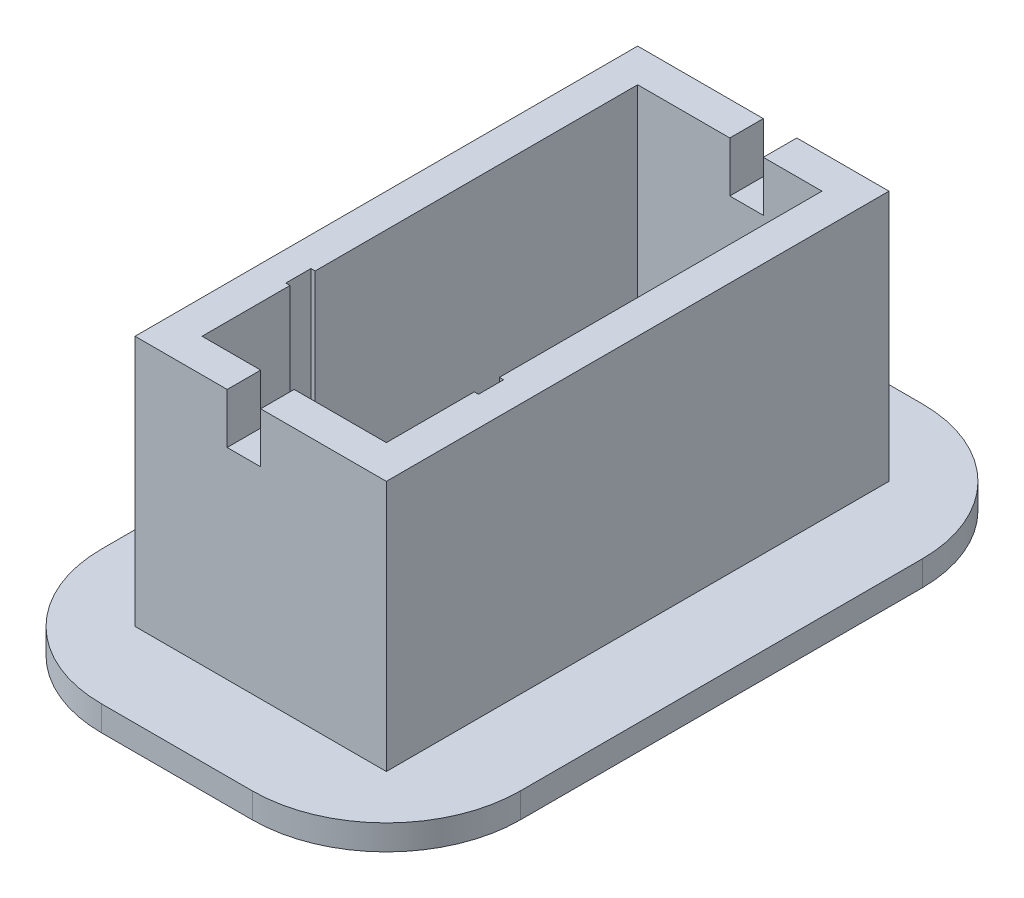
ISO-10303-21;
HEADER;
FILE_DESCRIPTION(('STEP AP214'),'2;1');
FILE_NAME('part.step','',(''),(''),'','','');
FILE_SCHEMA(('AUTOMOTIVE_DESIGN { 1 0 10303 214 1 1 1 1 }'));
ENDSEC;
DATA;
#1=APPLICATION_CONTEXT('core data for automotive mechanical design processes');
#2=APPLICATION_PROTOCOL_DEFINITION('international standard','automotive_design',2000,#1);
#3=PRODUCT_CONTEXT('',#1,'mechanical');
#4=PRODUCT('Part','Part','',(#3));
#5=PRODUCT_RELATED_PRODUCT_CATEGORY('part','',(#4));
#6=PRODUCT_DEFINITION_FORMATION('','',#4);
#7=PRODUCT_DEFINITION_CONTEXT('part definition',#1,'design');
#8=PRODUCT_DEFINITION('design','',#6,#7);
#9=PRODUCT_DEFINITION_SHAPE('','',#8);
#10=(LENGTH_UNIT() NAMED_UNIT(*) SI_UNIT(.MILLI.,.METRE.));
#11=(NAMED_UNIT(*) PLANE_ANGLE_UNIT() SI_UNIT($,.RADIAN.));
#12=(NAMED_UNIT(*) SI_UNIT($,.STERADIAN.) SOLID_ANGLE_UNIT());
#13=UNCERTAINTY_MEASURE_WITH_UNIT(LENGTH_MEASURE(1.E-05),#10,'distance_accuracy_value','');
#14=(GEOMETRIC_REPRESENTATION_CONTEXT(3) GLOBAL_UNCERTAINTY_ASSIGNED_CONTEXT((#13)) GLOBAL_UNIT_ASSIGNED_CONTEXT((#10,
#11,#12)) REPRESENTATION_CONTEXT('',''));
#15=CARTESIAN_POINT('',(0.,0.,0.));
#16=DIRECTION('',(0.,0.,1.));
#17=DIRECTION('',(1.,0.,0.));
#18=AXIS2_PLACEMENT_3D('',#15,#16,#17);
#19=CARTESIAN_POINT('',(0.,15.,0.));
#20=DIRECTION('',(0.,-1.,0.));
#21=DIRECTION('',(0.,0.,-1.));
#22=AXIS2_PLACEMENT_3D('',#19,#20,#21);
#23=PLANE('',#22);
#24=DIRECTION('',(1.,0.,0.));
#25=VECTOR('',#24,1.);
#26=CARTESIAN_POINT('',(2.,15.,-2.));
#27=LINE('',#26,#25);
#28=CARTESIAN_POINT('',(7.5,15.,-2.));
#29=VERTEX_POINT('',#28);
#30=CARTESIAN_POINT('',(13.,15.,-2.));
#31=VERTEX_POINT('',#30);
#32=EDGE_CURVE('E326',#29,#31,#27,.T.);
#33=ORIENTED_EDGE('',*,*,#32,.F.);
#34=DIRECTION('',(0.,0.,-1.));
#35=VECTOR('',#34,1.);
#36=CARTESIAN_POINT('',(7.5,15.,-2.));
#37=LINE('',#36,#35);
#38=CARTESIAN_POINT('',(7.5,15.,0.));
#39=VERTEX_POINT('',#38);
#40=EDGE_CURVE('E880',#39,#29,#37,.T.);
#41=ORIENTED_EDGE('',*,*,#40,.F.);
#42=DIRECTION('',(1.,0.,0.));
#43=VECTOR('',#42,1.);
#44=CARTESIAN_POINT('',(0.,15.,0.));
#45=LINE('',#44,#43);
#46=CARTESIAN_POINT('',(15.,15.,0.));
#47=VERTEX_POINT('',#46);
#48=EDGE_CURVE('E415',#39,#47,#45,.T.);
#49=ORIENTED_EDGE('',*,*,#48,.T.);
#50=DIRECTION('',(0.,0.,-1.));
#51=VECTOR('',#50,1.);
#52=CARTESIAN_POINT('',(15.,15.,0.));
#53=LINE('',#52,#51);
#54=CARTESIAN_POINT('',(15.,15.,-30.));
#55=VERTEX_POINT('',#54);
#56=EDGE_CURVE('E420',#47,#55,#53,.T.);
#57=ORIENTED_EDGE('',*,*,#56,.T.);
#58=DIRECTION('',(-1.,0.,0.));
#59=VECTOR('',#58,1.);
#60=CARTESIAN_POINT('',(0.,15.,-30.));
#61=LINE('',#60,#59);
#62=CARTESIAN_POINT('',(9.5,15.,-30.));
#63=VERTEX_POINT('',#62);
#64=EDGE_CURVE('E423',#55,#63,#61,.T.);
#65=ORIENTED_EDGE('',*,*,#64,.T.);
#66=DIRECTION('',(0.,0.,-1.));
#67=VECTOR('',#66,1.);
#68=CARTESIAN_POINT('',(9.5,15.,-30.));
#69=LINE('',#68,#67);
#70=CARTESIAN_POINT('',(9.5,15.,-28.));
#71=VERTEX_POINT('',#70);
#72=EDGE_CURVE('E280',#71,#63,#69,.T.);
#73=ORIENTED_EDGE('',*,*,#72,.F.);
#74=DIRECTION('',(-1.,0.,0.));
#75=VECTOR('',#74,1.);
#76=CARTESIAN_POINT('',(2.,15.,-28.));
#77=LINE('',#76,#75);
#78=CARTESIAN_POINT('',(13.,15.,-28.));
#79=VERTEX_POINT('',#78);
#80=EDGE_CURVE('E340',#79,#71,#77,.T.);
#81=ORIENTED_EDGE('',*,*,#80,.F.);
#82=DIRECTION('',(0.,0.,-1.));
#83=VECTOR('',#82,1.);
#84=CARTESIAN_POINT('',(13.,15.,-8.75));
#85=LINE('',#84,#83);
#86=CARTESIAN_POINT('',(13.,15.,-8.75));
#87=VERTEX_POINT('',#86);
#88=EDGE_CURVE('E337',#87,#79,#85,.T.);
#89=ORIENTED_EDGE('',*,*,#88,.F.);
#90=DIRECTION('',(-1.,0.,0.));
#91=VECTOR('',#90,1.);
#92=CARTESIAN_POINT('',(13.,15.,-8.75));
#93=LINE('',#92,#91);
#94=CARTESIAN_POINT('',(13.25,15.,-8.75));
#95=VERTEX_POINT('',#94);
#96=EDGE_CURVE('E335',#95,#87,#93,.T.);
#97=ORIENTED_EDGE('',*,*,#96,.F.);
#98=DIRECTION('',(0.,0.,-1.));
#99=VECTOR('',#98,1.);
#100=CARTESIAN_POINT('',(13.25,15.,-8.75));
#101=LINE('',#100,#99);
#102=CARTESIAN_POINT('',(13.25,15.,-7.25));
#103=VERTEX_POINT('',#102);
#104=EDGE_CURVE('E333',#103,#95,#101,.T.);
#105=ORIENTED_EDGE('',*,*,#104,.F.);
#106=DIRECTION('',(1.,0.,0.));
#107=VECTOR('',#106,1.);
#108=CARTESIAN_POINT('',(13.,15.,-7.25));
#109=LINE('',#108,#107);
#110=CARTESIAN_POINT('',(13.,15.,-7.25));
#111=VERTEX_POINT('',#110);
#112=EDGE_CURVE('E331',#111,#103,#109,.T.);
#113=ORIENTED_EDGE('',*,*,#112,.F.);
#114=DIRECTION('',(0.,0.,-1.));
#115=VECTOR('',#114,1.);
#116=CARTESIAN_POINT('',(13.,15.,-2.));
#117=LINE('',#116,#115);
#118=EDGE_CURVE('E329',#31,#111,#117,.T.);
#119=ORIENTED_EDGE('',*,*,#118,.F.);
#120=EDGE_LOOP('',(#33,#41,#49,#57,#65,#73,#81,#89,#97,#105,#113,#119));
#121=FACE_BOUND('',#120,.T.);
#122=ADVANCED_FACE('F35',(#121),#23,.F.);
#123=CARTESIAN_POINT('',(0.,15.,0.));
#124=VERTEX_POINT('',#123);
#125=CARTESIAN_POINT('',(5.5,15.,0.));
#126=VERTEX_POINT('',#125);
#127=EDGE_CURVE('E417',#124,#126,#45,.T.);
#128=ORIENTED_EDGE('',*,*,#127,.T.);
#129=DIRECTION('',(0.,0.,1.));
#130=VECTOR('',#129,1.);
#131=CARTESIAN_POINT('',(5.5,15.,-2.));
#132=LINE('',#131,#130);
#133=CARTESIAN_POINT('',(5.5,15.,-2.));
#134=VERTEX_POINT('',#133);
#135=EDGE_CURVE('E882',#134,#126,#132,.T.);
#136=ORIENTED_EDGE('',*,*,#135,.F.);
#137=CARTESIAN_POINT('',(2.,15.,-2.));
#138=VERTEX_POINT('',#137);
#139=EDGE_CURVE('E269',#138,#134,#27,.T.);
#140=ORIENTED_EDGE('',*,*,#139,.F.);
#141=DIRECTION('',(0.,0.,1.));
#142=VECTOR('',#141,1.);
#143=CARTESIAN_POINT('',(2.,15.,-2.));
#144=LINE('',#143,#142);
#145=CARTESIAN_POINT('',(2.,15.,-7.25));
#146=VERTEX_POINT('',#145);
#147=EDGE_CURVE('E324',#146,#138,#144,.T.);
#148=ORIENTED_EDGE('',*,*,#147,.F.);
#149=DIRECTION('',(1.,0.,0.));
#150=VECTOR('',#149,1.);
#151=CARTESIAN_POINT('',(2.,15.,-7.25));
#152=LINE('',#151,#150);
#153=CARTESIAN_POINT('',(1.75,15.,-7.25));
#154=VERTEX_POINT('',#153);
#155=EDGE_CURVE('E350',#154,#146,#152,.T.);
#156=ORIENTED_EDGE('',*,*,#155,.F.);
#157=DIRECTION('',(0.,0.,1.));
#158=VECTOR('',#157,1.);
#159=CARTESIAN_POINT('',(1.75,15.,-8.75));
#160=LINE('',#159,#158);
#161=CARTESIAN_POINT('',(1.75,15.,-8.75));
#162=VERTEX_POINT('',#161);
#163=EDGE_CURVE('E347',#162,#154,#160,.T.);
#164=ORIENTED_EDGE('',*,*,#163,.F.);
#165=DIRECTION('',(-1.,0.,0.));
#166=VECTOR('',#165,1.);
#167=CARTESIAN_POINT('',(2.,15.,-8.75));
#168=LINE('',#167,#166);
#169=CARTESIAN_POINT('',(2.,15.,-8.75));
#170=VERTEX_POINT('',#169);
#171=EDGE_CURVE('E345',#170,#162,#168,.T.);
#172=ORIENTED_EDGE('',*,*,#171,.F.);
#173=DIRECTION('',(0.,0.,1.));
#174=VECTOR('',#173,1.);
#175=CARTESIAN_POINT('',(2.,15.,-8.75));
#176=LINE('',#175,#174);
#177=CARTESIAN_POINT('',(2.,15.,-28.));
#178=VERTEX_POINT('',#177);
#179=EDGE_CURVE('E343',#178,#170,#176,.T.);
#180=ORIENTED_EDGE('',*,*,#179,.F.);
#181=CARTESIAN_POINT('',(7.5,15.,-28.));
#182=VERTEX_POINT('',#181);
#183=EDGE_CURVE('E339',#182,#178,#77,.T.);
#184=ORIENTED_EDGE('',*,*,#183,.F.);
#185=DIRECTION('',(0.,0.,1.));
#186=VECTOR('',#185,1.);
#187=CARTESIAN_POINT('',(7.5,15.,-30.));
#188=LINE('',#187,#186);
#189=CARTESIAN_POINT('',(7.5,15.,-30.));
#190=VERTEX_POINT('',#189);
#191=EDGE_CURVE('E290',#190,#182,#188,.T.);
#192=ORIENTED_EDGE('',*,*,#191,.F.);
#193=CARTESIAN_POINT('',(0.,15.,-30.));
#194=VERTEX_POINT('',#193);
#195=EDGE_CURVE('E422',#190,#194,#61,.T.);
#196=ORIENTED_EDGE('',*,*,#195,.T.);
#197=DIRECTION('',(0.,0.,1.));
#198=VECTOR('',#197,1.);
#199=CARTESIAN_POINT('',(0.,15.,0.));
#200=LINE('',#199,#198);
#201=EDGE_CURVE('E412',#194,#124,#200,.T.);
#202=ORIENTED_EDGE('',*,*,#201,.T.);
#203=EDGE_LOOP('',(#128,#136,#140,#148,#156,#164,#172,#180,#184,#192,#196,#202));
#204=FACE_BOUND('',#203,.T.);
#205=ADVANCED_FACE('F517',(#204),#23,.F.);
#206=CARTESIAN_POINT('',(0.,15.,0.));
#207=DIRECTION('',(1.,0.,0.));
#208=DIRECTION('',(0.,0.,-1.));
#209=AXIS2_PLACEMENT_3D('',#206,#207,#208);
#210=PLANE('',#209);
#211=DIRECTION('',(0.,0.,1.));
#212=VECTOR('',#211,1.);
#213=CARTESIAN_POINT('',(0.,0.,0.));
#214=LINE('',#213,#212);
#215=CARTESIAN_POINT('',(0.,0.,-30.));
#216=VERTEX_POINT('',#215);
#217=CARTESIAN_POINT('',(0.,0.,0.));
#218=VERTEX_POINT('',#217);
#219=EDGE_CURVE('E411',#216,#218,#214,.T.);
#220=ORIENTED_EDGE('',*,*,#219,.T.);
#221=DIRECTION('',(0.,-1.,0.));
#222=VECTOR('',#221,1.);
#223=CARTESIAN_POINT('',(0.,15.,0.));
#224=LINE('',#223,#222);
#225=EDGE_CURVE('E445',#124,#218,#224,.T.);
#226=ORIENTED_EDGE('',*,*,#225,.F.);
#227=ORIENTED_EDGE('',*,*,#201,.F.);
#228=DIRECTION('',(0.,-1.,0.));
#229=VECTOR('',#228,1.);
#230=CARTESIAN_POINT('',(0.,15.,-30.));
#231=LINE('',#230,#229);
#232=EDGE_CURVE('E426',#194,#216,#231,.T.);
#233=ORIENTED_EDGE('',*,*,#232,.T.);
#234=EDGE_LOOP('',(#220,#226,#227,#233));
#235=FACE_BOUND('',#234,.T.);
#236=ADVANCED_FACE('F523',(#235),#210,.F.);
#237=CARTESIAN_POINT('',(0.,15.,0.));
#238=DIRECTION('',(0.,0.,-1.));
#239=DIRECTION('',(-1.,0.,0.));
#240=AXIS2_PLACEMENT_3D('',#237,#238,#239);
#241=PLANE('',#240);
#242=ORIENTED_EDGE('',*,*,#48,.F.);
#243=DIRECTION('',(0.,1.,0.));
#244=VECTOR('',#243,1.);
#245=CARTESIAN_POINT('',(7.5,12.,0.));
#246=LINE('',#245,#244);
#247=CARTESIAN_POINT('',(7.5,12.,0.));
#248=VERTEX_POINT('',#247);
#249=EDGE_CURVE('E272',#248,#39,#246,.T.);
#250=ORIENTED_EDGE('',*,*,#249,.F.);
#251=DIRECTION('',(1.,0.,0.));
#252=VECTOR('',#251,1.);
#253=CARTESIAN_POINT('',(7.5,12.,0.));
#254=LINE('',#253,#252);
#255=CARTESIAN_POINT('',(5.5,12.,0.));
#256=VERTEX_POINT('',#255);
#257=EDGE_CURVE('E255',#256,#248,#254,.T.);
#258=ORIENTED_EDGE('',*,*,#257,.F.);
#259=DIRECTION('',(0.,1.,0.));
#260=VECTOR('',#259,1.);
#261=CARTESIAN_POINT('',(5.5,12.,0.));
#262=LINE('',#261,#260);
#263=EDGE_CURVE('E251',#256,#126,#262,.T.);
#264=ORIENTED_EDGE('',*,*,#263,.T.);
#265=ORIENTED_EDGE('',*,*,#127,.F.);
#266=ORIENTED_EDGE('',*,*,#225,.T.);
#267=DIRECTION('',(1.,0.,0.));
#268=VECTOR('',#267,1.);
#269=CARTESIAN_POINT('',(0.,0.,0.));
#270=LINE('',#269,#268);
#271=CARTESIAN_POINT('',(15.,0.,0.));
#272=VERTEX_POINT('',#271);
#273=EDGE_CURVE('E429',#218,#272,#270,.T.);
#274=ORIENTED_EDGE('',*,*,#273,.T.);
#275=DIRECTION('',(0.,-1.,0.));
#276=VECTOR('',#275,1.);
#277=CARTESIAN_POINT('',(15.,15.,0.));
#278=LINE('',#277,#276);
#279=EDGE_CURVE('E442',#47,#272,#278,.T.);
#280=ORIENTED_EDGE('',*,*,#279,.F.);
#281=EDGE_LOOP('',(#242,#250,#258,#264,#265,#266,#274,#280));
#282=FACE_BOUND('',#281,.T.);
#283=ADVANCED_FACE('F537',(#282),#241,.F.);
#284=CARTESIAN_POINT('',(15.,15.,0.));
#285=DIRECTION('',(-1.,0.,0.));
#286=DIRECTION('',(0.,0.,1.));
#287=AXIS2_PLACEMENT_3D('',#284,#285,#286);
#288=PLANE('',#287);
#289=DIRECTION('',(0.,0.,-1.));
#290=VECTOR('',#289,1.);
#291=CARTESIAN_POINT('',(15.,0.,0.));
#292=LINE('',#291,#290);
#293=CARTESIAN_POINT('',(15.,0.,-30.));
#294=VERTEX_POINT('',#293);
#295=EDGE_CURVE('E432',#272,#294,#292,.T.);
#296=ORIENTED_EDGE('',*,*,#295,.T.);
#297=DIRECTION('',(0.,-1.,0.));
#298=VECTOR('',#297,1.);
#299=CARTESIAN_POINT('',(15.,15.,-30.));
#300=LINE('',#299,#298);
#301=EDGE_CURVE('E439',#55,#294,#300,.T.);
#302=ORIENTED_EDGE('',*,*,#301,.F.);
#303=ORIENTED_EDGE('',*,*,#56,.F.);
#304=ORIENTED_EDGE('',*,*,#279,.T.);
#305=EDGE_LOOP('',(#296,#302,#303,#304));
#306=FACE_BOUND('',#305,.T.);
#307=ADVANCED_FACE('F533',(#306),#288,.F.);
#308=CARTESIAN_POINT('',(0.,15.,-30.));
#309=DIRECTION('',(0.,0.,1.));
#310=DIRECTION('',(1.,0.,0.));
#311=AXIS2_PLACEMENT_3D('',#308,#309,#310);
#312=PLANE('',#311);
#313=ORIENTED_EDGE('',*,*,#195,.F.);
#314=DIRECTION('',(0.,1.,0.));
#315=VECTOR('',#314,1.);
#316=CARTESIAN_POINT('',(7.5,12.,-30.));
#317=LINE('',#316,#315);
#318=CARTESIAN_POINT('',(7.5,12.,-30.));
#319=VERTEX_POINT('',#318);
#320=EDGE_CURVE('E293',#319,#190,#317,.T.);
#321=ORIENTED_EDGE('',*,*,#320,.F.);
#322=DIRECTION('',(-1.,0.,0.));
#323=VECTOR('',#322,1.);
#324=CARTESIAN_POINT('',(7.5,12.,-30.));
#325=LINE('',#324,#323);
#326=CARTESIAN_POINT('',(9.5,12.,-30.));
#327=VERTEX_POINT('',#326);
#328=EDGE_CURVE('E286',#327,#319,#325,.T.);
#329=ORIENTED_EDGE('',*,*,#328,.F.);
#330=DIRECTION('',(0.,1.,0.));
#331=VECTOR('',#330,1.);
#332=CARTESIAN_POINT('',(9.5,12.,-30.));
#333=LINE('',#332,#331);
#334=EDGE_CURVE('E296',#327,#63,#333,.T.);
#335=ORIENTED_EDGE('',*,*,#334,.T.);
#336=ORIENTED_EDGE('',*,*,#64,.F.);
#337=ORIENTED_EDGE('',*,*,#301,.T.);
#338=DIRECTION('',(-1.,0.,0.));
#339=VECTOR('',#338,1.);
#340=CARTESIAN_POINT('',(0.,0.,-30.));
#341=LINE('',#340,#339);
#342=EDGE_CURVE('E416',#294,#216,#341,.T.);
#343=ORIENTED_EDGE('',*,*,#342,.T.);
#344=ORIENTED_EDGE('',*,*,#232,.F.);
#345=EDGE_LOOP('',(#313,#321,#329,#335,#336,#337,#343,#344));
#346=FACE_BOUND('',#345,.T.);
#347=ADVANCED_FACE('F530',(#346),#312,.F.);
#348=CARTESIAN_POINT('',(2.,15.,-2.));
#349=DIRECTION('',(1.,0.,0.));
#350=DIRECTION('',(0.,0.,-1.));
#351=AXIS2_PLACEMENT_3D('',#348,#349,#350);
#352=PLANE('',#351);
#353=DIRECTION('',(0.,0.,1.));
#354=VECTOR('',#353,1.);
#355=CARTESIAN_POINT('',(2.,0.,-2.));
#356=LINE('',#355,#354);
#357=CARTESIAN_POINT('',(2.,0.,-7.25));
#358=VERTEX_POINT('',#357);
#359=CARTESIAN_POINT('',(2.,0.,-2.));
#360=VERTEX_POINT('',#359);
#361=EDGE_CURVE('E314',#358,#360,#356,.T.);
#362=ORIENTED_EDGE('',*,*,#361,.F.);
#363=DIRECTION('',(0.,-1.,0.));
#364=VECTOR('',#363,1.);
#365=CARTESIAN_POINT('',(2.,15.,-7.25));
#366=LINE('',#365,#364);
#367=EDGE_CURVE('E352',#146,#358,#366,.T.);
#368=ORIENTED_EDGE('',*,*,#367,.F.);
#369=ORIENTED_EDGE('',*,*,#147,.T.);
#370=DIRECTION('',(0.,-1.,0.));
#371=VECTOR('',#370,1.);
#372=CARTESIAN_POINT('',(2.,15.,-2.));
#373=LINE('',#372,#371);
#374=EDGE_CURVE('E408',#138,#360,#373,.T.);
#375=ORIENTED_EDGE('',*,*,#374,.T.);
#376=EDGE_LOOP('',(#362,#368,#369,#375));
#377=FACE_BOUND('',#376,.T.);
#378=ADVANCED_FACE('F528',(#377),#352,.T.);
#379=CARTESIAN_POINT('',(2.,15.,-2.));
#380=DIRECTION('',(0.,0.,-1.));
#381=DIRECTION('',(-1.,0.,0.));
#382=AXIS2_PLACEMENT_3D('',#379,#380,#381);
#383=PLANE('',#382);
#384=DIRECTION('',(0.,1.,0.));
#385=VECTOR('',#384,1.);
#386=CARTESIAN_POINT('',(7.5,12.,-2.));
#387=LINE('',#386,#385);
#388=CARTESIAN_POINT('',(7.5,12.,-2.));
#389=VERTEX_POINT('',#388);
#390=EDGE_CURVE('E270',#389,#29,#387,.T.);
#391=ORIENTED_EDGE('',*,*,#390,.T.);
#392=ORIENTED_EDGE('',*,*,#32,.T.);
#393=DIRECTION('',(0.,-1.,0.));
#394=VECTOR('',#393,1.);
#395=CARTESIAN_POINT('',(13.,15.,-2.));
#396=LINE('',#395,#394);
#397=CARTESIAN_POINT('',(13.,0.,-2.));
#398=VERTEX_POINT('',#397);
#399=EDGE_CURVE('E406',#31,#398,#396,.T.);
#400=ORIENTED_EDGE('',*,*,#399,.T.);
#401=DIRECTION('',(1.,0.,0.));
#402=VECTOR('',#401,1.);
#403=CARTESIAN_POINT('',(2.,0.,-2.));
#404=LINE('',#403,#402);
#405=EDGE_CURVE('E355',#360,#398,#404,.T.);
#406=ORIENTED_EDGE('',*,*,#405,.F.);
#407=ORIENTED_EDGE('',*,*,#374,.F.);
#408=ORIENTED_EDGE('',*,*,#139,.T.);
#409=DIRECTION('',(0.,1.,0.));
#410=VECTOR('',#409,1.);
#411=CARTESIAN_POINT('',(5.5,12.,-2.));
#412=LINE('',#411,#410);
#413=CARTESIAN_POINT('',(5.5,12.,-2.));
#414=VERTEX_POINT('',#413);
#415=EDGE_CURVE('E248',#414,#134,#412,.T.);
#416=ORIENTED_EDGE('',*,*,#415,.F.);
#417=DIRECTION('',(-1.,0.,0.));
#418=VECTOR('',#417,1.);
#419=CARTESIAN_POINT('',(7.5,12.,-2.));
#420=LINE('',#419,#418);
#421=EDGE_CURVE('E256',#389,#414,#420,.T.);
#422=ORIENTED_EDGE('',*,*,#421,.F.);
#423=EDGE_LOOP('',(#391,#392,#400,#406,#407,#408,#416,#422));
#424=FACE_BOUND('',#423,.T.);
#425=ADVANCED_FACE('F266',(#424),#383,.T.);
#426=CARTESIAN_POINT('',(13.,15.,-2.));
#427=DIRECTION('',(-1.,0.,0.));
#428=DIRECTION('',(0.,0.,1.));
#429=AXIS2_PLACEMENT_3D('',#426,#427,#428);
#430=PLANE('',#429);
#431=DIRECTION('',(0.,0.,-1.));
#432=VECTOR('',#431,1.);
#433=CARTESIAN_POINT('',(13.,0.,-2.));
#434=LINE('',#433,#432);
#435=CARTESIAN_POINT('',(13.,0.,-7.25));
#436=VERTEX_POINT('',#435);
#437=EDGE_CURVE('E358',#398,#436,#434,.T.);
#438=ORIENTED_EDGE('',*,*,#437,.F.);
#439=ORIENTED_EDGE('',*,*,#399,.F.);
#440=ORIENTED_EDGE('',*,*,#118,.T.);
#441=DIRECTION('',(0.,-1.,0.));
#442=VECTOR('',#441,1.);
#443=CARTESIAN_POINT('',(13.,15.,-7.25));
#444=LINE('',#443,#442);
#445=EDGE_CURVE('E404',#111,#436,#444,.T.);
#446=ORIENTED_EDGE('',*,*,#445,.T.);
#447=EDGE_LOOP('',(#438,#439,#440,#446));
#448=FACE_BOUND('',#447,.T.);
#449=ADVANCED_FACE('F755',(#448),#430,.T.);
#450=CARTESIAN_POINT('',(13.,15.,-7.25));
#451=DIRECTION('',(0.,0.,-1.));
#452=DIRECTION('',(-1.,0.,0.));
#453=AXIS2_PLACEMENT_3D('',#450,#451,#452);
#454=PLANE('',#453);
#455=DIRECTION('',(1.,0.,0.));
#456=VECTOR('',#455,1.);
#457=CARTESIAN_POINT('',(13.,0.,-7.25));
#458=LINE('',#457,#456);
#459=CARTESIAN_POINT('',(13.25,0.,-7.25));
#460=VERTEX_POINT('',#459);
#461=EDGE_CURVE('E361',#436,#460,#458,.T.);
#462=ORIENTED_EDGE('',*,*,#461,.F.);
#463=ORIENTED_EDGE('',*,*,#445,.F.);
#464=ORIENTED_EDGE('',*,*,#112,.T.);
#465=DIRECTION('',(0.,-1.,0.));
#466=VECTOR('',#465,1.);
#467=CARTESIAN_POINT('',(13.25,15.,-7.25));
#468=LINE('',#467,#466);
#469=EDGE_CURVE('E402',#103,#460,#468,.T.);
#470=ORIENTED_EDGE('',*,*,#469,.T.);
#471=EDGE_LOOP('',(#462,#463,#464,#470));
#472=FACE_BOUND('',#471,.T.);
#473=ADVANCED_FACE('F746',(#472),#454,.T.);
#474=CARTESIAN_POINT('',(13.25,15.,-8.75));
#475=DIRECTION('',(-1.,0.,0.));
#476=DIRECTION('',(0.,0.,1.));
#477=AXIS2_PLACEMENT_3D('',#474,#475,#476);
#478=PLANE('',#477);
#479=DIRECTION('',(0.,0.,-1.));
#480=VECTOR('',#479,1.);
#481=CARTESIAN_POINT('',(13.25,0.,-8.75));
#482=LINE('',#481,#480);
#483=CARTESIAN_POINT('',(13.25,0.,-8.75));
#484=VERTEX_POINT('',#483);
#485=EDGE_CURVE('E364',#460,#484,#482,.T.);
#486=ORIENTED_EDGE('',*,*,#485,.F.);
#487=ORIENTED_EDGE('',*,*,#469,.F.);
#488=ORIENTED_EDGE('',*,*,#104,.T.);
#489=DIRECTION('',(0.,-1.,0.));
#490=VECTOR('',#489,1.);
#491=CARTESIAN_POINT('',(13.25,15.,-8.75));
#492=LINE('',#491,#490);
#493=EDGE_CURVE('E400',#95,#484,#492,.T.);
#494=ORIENTED_EDGE('',*,*,#493,.T.);
#495=EDGE_LOOP('',(#486,#487,#488,#494));
#496=FACE_BOUND('',#495,.T.);
#497=ADVANCED_FACE('F737',(#496),#478,.T.);
#498=CARTESIAN_POINT('',(13.,15.,-8.75));
#499=DIRECTION('',(0.,0.,1.));
#500=DIRECTION('',(1.,0.,0.));
#501=AXIS2_PLACEMENT_3D('',#498,#499,#500);
#502=PLANE('',#501);
#503=DIRECTION('',(-1.,0.,0.));
#504=VECTOR('',#503,1.);
#505=CARTESIAN_POINT('',(13.,0.,-8.75));
#506=LINE('',#505,#504);
#507=CARTESIAN_POINT('',(13.,0.,-8.75));
#508=VERTEX_POINT('',#507);
#509=EDGE_CURVE('E367',#484,#508,#506,.T.);
#510=ORIENTED_EDGE('',*,*,#509,.F.);
#511=ORIENTED_EDGE('',*,*,#493,.F.);
#512=ORIENTED_EDGE('',*,*,#96,.T.);
#513=DIRECTION('',(0.,-1.,0.));
#514=VECTOR('',#513,1.);
#515=CARTESIAN_POINT('',(13.,15.,-8.75));
#516=LINE('',#515,#514);
#517=EDGE_CURVE('E398',#87,#508,#516,.T.);
#518=ORIENTED_EDGE('',*,*,#517,.T.);
#519=EDGE_LOOP('',(#510,#511,#512,#518));
#520=FACE_BOUND('',#519,.T.);
#521=ADVANCED_FACE('F728',(#520),#502,.T.);
#522=CARTESIAN_POINT('',(13.,15.,-8.75));
#523=DIRECTION('',(-1.,0.,0.));
#524=DIRECTION('',(0.,0.,1.));
#525=AXIS2_PLACEMENT_3D('',#522,#523,#524);
#526=PLANE('',#525);
#527=DIRECTION('',(0.,0.,-1.));
#528=VECTOR('',#527,1.);
#529=CARTESIAN_POINT('',(13.,0.,-8.75));
#530=LINE('',#529,#528);
#531=CARTESIAN_POINT('',(13.,0.,-28.));
#532=VERTEX_POINT('',#531);
#533=EDGE_CURVE('E370',#508,#532,#530,.T.);
#534=ORIENTED_EDGE('',*,*,#533,.F.);
#535=ORIENTED_EDGE('',*,*,#517,.F.);
#536=ORIENTED_EDGE('',*,*,#88,.T.);
#537=DIRECTION('',(0.,-1.,0.));
#538=VECTOR('',#537,1.);
#539=CARTESIAN_POINT('',(13.,15.,-28.));
#540=LINE('',#539,#538);
#541=EDGE_CURVE('E396',#79,#532,#540,.T.);
#542=ORIENTED_EDGE('',*,*,#541,.T.);
#543=EDGE_LOOP('',(#534,#535,#536,#542));
#544=FACE_BOUND('',#543,.T.);
#545=ADVANCED_FACE('F719',(#544),#526,.T.);
#546=CARTESIAN_POINT('',(2.,15.,-28.));
#547=DIRECTION('',(0.,0.,1.));
#548=DIRECTION('',(1.,0.,0.));
#549=AXIS2_PLACEMENT_3D('',#546,#547,#548);
#550=PLANE('',#549);
#551=DIRECTION('',(0.,1.,0.));
#552=VECTOR('',#551,1.);
#553=CARTESIAN_POINT('',(7.5,12.,-28.));
#554=LINE('',#553,#552);
#555=CARTESIAN_POINT('',(7.5,12.,-28.));
#556=VERTEX_POINT('',#555);
#557=EDGE_CURVE('E289',#556,#182,#554,.T.);
#558=ORIENTED_EDGE('',*,*,#557,.T.);
#559=ORIENTED_EDGE('',*,*,#183,.T.);
#560=DIRECTION('',(0.,-1.,0.));
#561=VECTOR('',#560,1.);
#562=CARTESIAN_POINT('',(2.,15.,-28.));
#563=LINE('',#562,#561);
#564=CARTESIAN_POINT('',(2.,0.,-28.));
#565=VERTEX_POINT('',#564);
#566=EDGE_CURVE('E394',#178,#565,#563,.T.);
#567=ORIENTED_EDGE('',*,*,#566,.T.);
#568=DIRECTION('',(-1.,0.,0.));
#569=VECTOR('',#568,1.);
#570=CARTESIAN_POINT('',(2.,0.,-28.));
#571=LINE('',#570,#569);
#572=EDGE_CURVE('E373',#532,#565,#571,.T.);
#573=ORIENTED_EDGE('',*,*,#572,.F.);
#574=ORIENTED_EDGE('',*,*,#541,.F.);
#575=ORIENTED_EDGE('',*,*,#80,.T.);
#576=DIRECTION('',(0.,1.,0.));
#577=VECTOR('',#576,1.);
#578=CARTESIAN_POINT('',(9.5,12.,-28.));
#579=LINE('',#578,#577);
#580=CARTESIAN_POINT('',(9.5,12.,-28.));
#581=VERTEX_POINT('',#580);
#582=EDGE_CURVE('E299',#581,#71,#579,.T.);
#583=ORIENTED_EDGE('',*,*,#582,.F.);
#584=DIRECTION('',(1.,0.,0.));
#585=VECTOR('',#584,1.);
#586=CARTESIAN_POINT('',(7.5,12.,-28.));
#587=LINE('',#586,#585);
#588=EDGE_CURVE('E279',#556,#581,#587,.T.);
#589=ORIENTED_EDGE('',*,*,#588,.F.);
#590=EDGE_LOOP('',(#558,#559,#567,#573,#574,#575,#583,#589));
#591=FACE_BOUND('',#590,.T.);
#592=ADVANCED_FACE('F710',(#591),#550,.T.);
#593=CARTESIAN_POINT('',(2.,15.,-8.75));
#594=DIRECTION('',(1.,0.,0.));
#595=DIRECTION('',(0.,0.,-1.));
#596=AXIS2_PLACEMENT_3D('',#593,#594,#595);
#597=PLANE('',#596);
#598=DIRECTION('',(0.,0.,1.));
#599=VECTOR('',#598,1.);
#600=CARTESIAN_POINT('',(2.,0.,-8.75));
#601=LINE('',#600,#599);
#602=CARTESIAN_POINT('',(2.,0.,-8.75));
#603=VERTEX_POINT('',#602);
#604=EDGE_CURVE('E376',#565,#603,#601,.T.);
#605=ORIENTED_EDGE('',*,*,#604,.F.);
#606=ORIENTED_EDGE('',*,*,#566,.F.);
#607=ORIENTED_EDGE('',*,*,#179,.T.);
#608=DIRECTION('',(0.,-1.,0.));
#609=VECTOR('',#608,1.);
#610=CARTESIAN_POINT('',(2.,15.,-8.75));
#611=LINE('',#610,#609);
#612=EDGE_CURVE('E392',#170,#603,#611,.T.);
#613=ORIENTED_EDGE('',*,*,#612,.T.);
#614=EDGE_LOOP('',(#605,#606,#607,#613));
#615=FACE_BOUND('',#614,.T.);
#616=ADVANCED_FACE('F701',(#615),#597,.T.);
#617=CARTESIAN_POINT('',(2.,15.,-8.75));
#618=DIRECTION('',(0.,0.,1.));
#619=DIRECTION('',(1.,0.,0.));
#620=AXIS2_PLACEMENT_3D('',#617,#618,#619);
#621=PLANE('',#620);
#622=DIRECTION('',(-1.,0.,0.));
#623=VECTOR('',#622,1.);
#624=CARTESIAN_POINT('',(2.,0.,-8.75));
#625=LINE('',#624,#623);
#626=CARTESIAN_POINT('',(1.75,0.,-8.75));
#627=VERTEX_POINT('',#626);
#628=EDGE_CURVE('E379',#603,#627,#625,.T.);
#629=ORIENTED_EDGE('',*,*,#628,.F.);
#630=ORIENTED_EDGE('',*,*,#612,.F.);
#631=ORIENTED_EDGE('',*,*,#171,.T.);
#632=DIRECTION('',(0.,-1.,0.));
#633=VECTOR('',#632,1.);
#634=CARTESIAN_POINT('',(1.75,15.,-8.75));
#635=LINE('',#634,#633);
#636=EDGE_CURVE('E390',#162,#627,#635,.T.);
#637=ORIENTED_EDGE('',*,*,#636,.T.);
#638=EDGE_LOOP('',(#629,#630,#631,#637));
#639=FACE_BOUND('',#638,.T.);
#640=ADVANCED_FACE('F692',(#639),#621,.T.);
#641=CARTESIAN_POINT('',(1.75,15.,-8.75));
#642=DIRECTION('',(1.,0.,0.));
#643=DIRECTION('',(0.,0.,-1.));
#644=AXIS2_PLACEMENT_3D('',#641,#642,#643);
#645=PLANE('',#644);
#646=DIRECTION('',(0.,0.,1.));
#647=VECTOR('',#646,1.);
#648=CARTESIAN_POINT('',(1.75,0.,-8.75));
#649=LINE('',#648,#647);
#650=CARTESIAN_POINT('',(1.75,0.,-7.25));
#651=VERTEX_POINT('',#650);
#652=EDGE_CURVE('E382',#627,#651,#649,.T.);
#653=ORIENTED_EDGE('',*,*,#652,.F.);
#654=ORIENTED_EDGE('',*,*,#636,.F.);
#655=ORIENTED_EDGE('',*,*,#163,.T.);
#656=DIRECTION('',(0.,-1.,0.));
#657=VECTOR('',#656,1.);
#658=CARTESIAN_POINT('',(1.75,15.,-7.25));
#659=LINE('',#658,#657);
#660=EDGE_CURVE('E388',#154,#651,#659,.T.);
#661=ORIENTED_EDGE('',*,*,#660,.T.);
#662=EDGE_LOOP('',(#653,#654,#655,#661));
#663=FACE_BOUND('',#662,.T.);
#664=ADVANCED_FACE('F683',(#663),#645,.T.);
#665=CARTESIAN_POINT('',(2.,15.,-7.25));
#666=DIRECTION('',(0.,0.,-1.));
#667=DIRECTION('',(-1.,0.,0.));
#668=AXIS2_PLACEMENT_3D('',#665,#666,#667);
#669=PLANE('',#668);
#670=DIRECTION('',(1.,0.,0.));
#671=VECTOR('',#670,1.);
#672=CARTESIAN_POINT('',(2.,0.,-7.25));
#673=LINE('',#672,#671);
#674=EDGE_CURVE('E327',#651,#358,#673,.T.);
#675=ORIENTED_EDGE('',*,*,#674,.F.);
#676=ORIENTED_EDGE('',*,*,#660,.F.);
#677=ORIENTED_EDGE('',*,*,#155,.T.);
#678=ORIENTED_EDGE('',*,*,#367,.T.);
#679=EDGE_LOOP('',(#675,#676,#677,#678));
#680=FACE_BOUND('',#679,.T.);
#681=ADVANCED_FACE('F675',(#680),#669,.T.);
#682=CARTESIAN_POINT('',(0.,0.,0.));
#683=DIRECTION('',(0.,-1.,0.));
#684=DIRECTION('',(0.,0.,-1.));
#685=AXIS2_PLACEMENT_3D('',#682,#683,#684);
#686=PLANE('',#685);
#687=ORIENTED_EDGE('',*,*,#361,.T.);
#688=ORIENTED_EDGE('',*,*,#405,.T.);
#689=ORIENTED_EDGE('',*,*,#437,.T.);
#690=ORIENTED_EDGE('',*,*,#461,.T.);
#691=ORIENTED_EDGE('',*,*,#485,.T.);
#692=ORIENTED_EDGE('',*,*,#509,.T.);
#693=ORIENTED_EDGE('',*,*,#533,.T.);
#694=ORIENTED_EDGE('',*,*,#572,.T.);
#695=ORIENTED_EDGE('',*,*,#604,.T.);
#696=ORIENTED_EDGE('',*,*,#628,.T.);
#697=ORIENTED_EDGE('',*,*,#652,.T.);
#698=ORIENTED_EDGE('',*,*,#674,.T.);
#699=EDGE_LOOP('',(#687,#688,#689,#690,#691,#692,#693,#694,#695,#696,#697,#698));
#700=FACE_BOUND('',#699,.T.);
#701=ADVANCED_FACE('F668',(#700),#686,.F.);
#702=DIRECTION('',(0.,0.,1.));
#703=VECTOR('',#702,1.);
#704=CARTESIAN_POINT('',(20.,0.,5.));
#705=LINE('',#704,#703);
#706=CARTESIAN_POINT('',(20.,0.,-27.));
#707=VERTEX_POINT('',#706);
#708=CARTESIAN_POINT('',(20.,0.,-3.));
#709=VERTEX_POINT('',#708);
#710=EDGE_CURVE('E320',#707,#709,#705,.T.);
#711=ORIENTED_EDGE('',*,*,#710,.F.);
#712=CARTESIAN_POINT('',(12.,0.,-27.));
#713=DIRECTION('',(0.,-1.,0.));
#714=DIRECTION('',(0.,0.,-1.));
#715=AXIS2_PLACEMENT_3D('',#712,#713,#714);
#716=CIRCLE('',#715,8.);
#717=CARTESIAN_POINT('',(12.,0.,-35.));
#718=VERTEX_POINT('',#717);
#719=EDGE_CURVE('E459',#707,#718,#716,.F.);
#720=ORIENTED_EDGE('',*,*,#719,.T.);
#721=DIRECTION('',(1.,0.,0.));
#722=VECTOR('',#721,1.);
#723=CARTESIAN_POINT('',(-5.,0.,-35.));
#724=LINE('',#723,#722);
#725=CARTESIAN_POINT('',(3.,0.,-35.));
#726=VERTEX_POINT('',#725);
#727=EDGE_CURVE('E317',#726,#718,#724,.T.);
#728=ORIENTED_EDGE('',*,*,#727,.F.);
#729=CARTESIAN_POINT('',(3.,0.,-27.));
#730=DIRECTION('',(0.,-1.,0.));
#731=DIRECTION('',(0.,0.,-1.));
#732=AXIS2_PLACEMENT_3D('',#729,#730,#731);
#733=CIRCLE('',#732,8.);
#734=CARTESIAN_POINT('',(-5.,0.,-27.));
#735=VERTEX_POINT('',#734);
#736=EDGE_CURVE('E457',#726,#735,#733,.F.);
#737=ORIENTED_EDGE('',*,*,#736,.T.);
#738=DIRECTION('',(0.,0.,-1.));
#739=VECTOR('',#738,1.);
#740=CARTESIAN_POINT('',(-5.,0.,5.));
#741=LINE('',#740,#739);
#742=CARTESIAN_POINT('',(-5.,0.,-3.));
#743=VERTEX_POINT('',#742);
#744=EDGE_CURVE('E295',#743,#735,#741,.T.);
#745=ORIENTED_EDGE('',*,*,#744,.F.);
#746=CARTESIAN_POINT('',(3.,0.,-3.));
#747=DIRECTION('',(0.,-1.,0.));
#748=DIRECTION('',(0.,0.,-1.));
#749=AXIS2_PLACEMENT_3D('',#746,#747,#748);
#750=CIRCLE('',#749,8.);
#751=CARTESIAN_POINT('',(3.,0.,5.));
#752=VERTEX_POINT('',#751);
#753=EDGE_CURVE('E453',#743,#752,#750,.F.);
#754=ORIENTED_EDGE('',*,*,#753,.T.);
#755=DIRECTION('',(-1.,0.,0.));
#756=VECTOR('',#755,1.);
#757=CARTESIAN_POINT('',(-5.,0.,5.));
#758=LINE('',#757,#756);
#759=CARTESIAN_POINT('',(12.,0.,5.));
#760=VERTEX_POINT('',#759);
#761=EDGE_CURVE('E307',#760,#752,#758,.T.);
#762=ORIENTED_EDGE('',*,*,#761,.F.);
#763=CARTESIAN_POINT('',(12.,0.,-3.));
#764=DIRECTION('',(0.,-1.,0.));
#765=DIRECTION('',(0.,0.,-1.));
#766=AXIS2_PLACEMENT_3D('',#763,#764,#765);
#767=CIRCLE('',#766,8.);
#768=EDGE_CURVE('E455',#760,#709,#767,.F.);
#769=ORIENTED_EDGE('',*,*,#768,.T.);
#770=EDGE_LOOP('',(#711,#720,#728,#737,#745,#754,#762,#769));
#771=FACE_BOUND('',#770,.T.);
#772=ORIENTED_EDGE('',*,*,#273,.F.);
#773=ORIENTED_EDGE('',*,*,#219,.F.);
#774=ORIENTED_EDGE('',*,*,#342,.F.);
#775=ORIENTED_EDGE('',*,*,#295,.F.);
#776=EDGE_LOOP('',(#772,#773,#774,#775));
#777=FACE_BOUND('',#776,.T.);
#778=ADVANCED_FACE('F496',(#771,#777),#686,.F.);
#779=CARTESIAN_POINT('',(-5.,-1.5,5.));
#780=DIRECTION('',(1.,0.,0.));
#781=DIRECTION('',(0.,0.,-1.));
#782=AXIS2_PLACEMENT_3D('',#779,#780,#781);
#783=PLANE('',#782);
#784=ORIENTED_EDGE('',*,*,#744,.T.);
#785=DIRECTION('',(0.,1.,0.));
#786=VECTOR('',#785,1.);
#787=CARTESIAN_POINT('',(-5.,-1.5,-27.));
#788=LINE('',#787,#786);
#789=CARTESIAN_POINT('',(-5.,-1.5,-27.));
#790=VERTEX_POINT('',#789);
#791=EDGE_CURVE('E476',#735,#790,#788,.F.);
#792=ORIENTED_EDGE('',*,*,#791,.T.);
#793=DIRECTION('',(0.,0.,-1.));
#794=VECTOR('',#793,1.);
#795=CARTESIAN_POINT('',(-5.,-1.5,5.));
#796=LINE('',#795,#794);
#797=CARTESIAN_POINT('',(-5.,-1.5,-3.));
#798=VERTEX_POINT('',#797);
#799=EDGE_CURVE('E303',#798,#790,#796,.T.);
#800=ORIENTED_EDGE('',*,*,#799,.F.);
#801=DIRECTION('',(0.,1.,0.));
#802=VECTOR('',#801,1.);
#803=CARTESIAN_POINT('',(-5.,-1.5,-3.));
#804=LINE('',#803,#802);
#805=EDGE_CURVE('E473',#798,#743,#804,.T.);
#806=ORIENTED_EDGE('',*,*,#805,.T.);
#807=EDGE_LOOP('',(#784,#792,#800,#806));
#808=FACE_BOUND('',#807,.T.);
#809=ADVANCED_FACE('F480',(#808),#783,.F.);
#810=CARTESIAN_POINT('',(-5.,-1.5,-35.));
#811=DIRECTION('',(0.,0.,1.));
#812=DIRECTION('',(1.,0.,0.));
#813=AXIS2_PLACEMENT_3D('',#810,#811,#812);
#814=PLANE('',#813);
#815=ORIENTED_EDGE('',*,*,#727,.T.);
#816=DIRECTION('',(0.,1.,0.));
#817=VECTOR('',#816,1.);
#818=CARTESIAN_POINT('',(12.,-1.5,-35.));
#819=LINE('',#818,#817);
#820=CARTESIAN_POINT('',(12.,-1.5,-35.));
#821=VERTEX_POINT('',#820);
#822=EDGE_CURVE('E464',#718,#821,#819,.F.);
#823=ORIENTED_EDGE('',*,*,#822,.T.);
#824=DIRECTION('',(1.,0.,0.));
#825=VECTOR('',#824,1.);
#826=CARTESIAN_POINT('',(-5.,-1.5,-35.));
#827=LINE('',#826,#825);
#828=CARTESIAN_POINT('',(3.,-1.5,-35.));
#829=VERTEX_POINT('',#828);
#830=EDGE_CURVE('E306',#829,#821,#827,.T.);
#831=ORIENTED_EDGE('',*,*,#830,.F.);
#832=DIRECTION('',(0.,1.,0.));
#833=VECTOR('',#832,1.);
#834=CARTESIAN_POINT('',(3.,-1.5,-35.));
#835=LINE('',#834,#833);
#836=EDGE_CURVE('E461',#829,#726,#835,.T.);
#837=ORIENTED_EDGE('',*,*,#836,.T.);
#838=EDGE_LOOP('',(#815,#823,#831,#837));
#839=FACE_BOUND('',#838,.T.);
#840=ADVANCED_FACE('F492',(#839),#814,.F.);
#841=CARTESIAN_POINT('',(20.,-1.5,5.));
#842=DIRECTION('',(-1.,0.,0.));
#843=DIRECTION('',(0.,0.,1.));
#844=AXIS2_PLACEMENT_3D('',#841,#842,#843);
#845=PLANE('',#844);
#846=DIRECTION('',(0.,0.,1.));
#847=VECTOR('',#846,1.);
#848=CARTESIAN_POINT('',(20.,-1.5,5.));
#849=LINE('',#848,#847);
#850=CARTESIAN_POINT('',(20.,-1.5,-27.));
#851=VERTEX_POINT('',#850);
#852=CARTESIAN_POINT('',(20.,-1.5,-3.));
#853=VERTEX_POINT('',#852);
#854=EDGE_CURVE('E310',#851,#853,#849,.T.);
#855=ORIENTED_EDGE('',*,*,#854,.F.);
#856=DIRECTION('',(0.,1.,0.));
#857=VECTOR('',#856,1.);
#858=CARTESIAN_POINT('',(20.,-1.5,-27.));
#859=LINE('',#858,#857);
#860=EDGE_CURVE('E450',#851,#707,#859,.T.);
#861=ORIENTED_EDGE('',*,*,#860,.T.);
#862=ORIENTED_EDGE('',*,*,#710,.T.);
#863=DIRECTION('',(0.,1.,0.));
#864=VECTOR('',#863,1.);
#865=CARTESIAN_POINT('',(20.,-1.5,-3.));
#866=LINE('',#865,#864);
#867=EDGE_CURVE('E448',#709,#853,#866,.F.);
#868=ORIENTED_EDGE('',*,*,#867,.T.);
#869=EDGE_LOOP('',(#855,#861,#862,#868));
#870=FACE_BOUND('',#869,.T.);
#871=ADVANCED_FACE('F504',(#870),#845,.F.);
#872=CARTESIAN_POINT('',(-5.,-1.5,5.));
#873=DIRECTION('',(0.,0.,-1.));
#874=DIRECTION('',(-1.,0.,0.));
#875=AXIS2_PLACEMENT_3D('',#872,#873,#874);
#876=PLANE('',#875);
#877=DIRECTION('',(-1.,0.,0.));
#878=VECTOR('',#877,1.);
#879=CARTESIAN_POINT('',(-5.,-1.5,5.));
#880=LINE('',#879,#878);
#881=CARTESIAN_POINT('',(12.,-1.5,5.));
#882=VERTEX_POINT('',#881);
#883=CARTESIAN_POINT('',(3.,-1.5,5.));
#884=VERTEX_POINT('',#883);
#885=EDGE_CURVE('E312',#882,#884,#880,.T.);
#886=ORIENTED_EDGE('',*,*,#885,.F.);
#887=DIRECTION('',(0.,1.,0.));
#888=VECTOR('',#887,1.);
#889=CARTESIAN_POINT('',(12.,-1.5,5.));
#890=LINE('',#889,#888);
#891=EDGE_CURVE('E11',#882,#760,#890,.T.);
#892=ORIENTED_EDGE('',*,*,#891,.T.);
#893=ORIENTED_EDGE('',*,*,#761,.T.);
#894=DIRECTION('',(0.,1.,0.));
#895=VECTOR('',#894,1.);
#896=CARTESIAN_POINT('',(3.,-1.5,5.));
#897=LINE('',#896,#895);
#898=EDGE_CURVE('E43',#752,#884,#897,.F.);
#899=ORIENTED_EDGE('',*,*,#898,.T.);
#900=EDGE_LOOP('',(#886,#892,#893,#899));
#901=FACE_BOUND('',#900,.T.);
#902=ADVANCED_FACE('F510',(#901),#876,.F.);
#903=CARTESIAN_POINT('',(0.,-1.5,0.));
#904=DIRECTION('',(0.,-1.,0.));
#905=DIRECTION('',(0.,0.,-1.));
#906=AXIS2_PLACEMENT_3D('',#903,#904,#905);
#907=PLANE('',#906);
#908=ORIENTED_EDGE('',*,*,#830,.T.);
#909=CARTESIAN_POINT('',(12.,-1.5,-27.));
#910=DIRECTION('',(0.,-1.,0.));
#911=DIRECTION('',(0.,0.,-1.));
#912=AXIS2_PLACEMENT_3D('',#909,#910,#911);
#913=CIRCLE('',#912,8.);
#914=EDGE_CURVE('E471',#821,#851,#913,.T.);
#915=ORIENTED_EDGE('',*,*,#914,.T.);
#916=ORIENTED_EDGE('',*,*,#854,.T.);
#917=CARTESIAN_POINT('',(12.,-1.5,-3.));
#918=DIRECTION('',(0.,-1.,0.));
#919=DIRECTION('',(0.,0.,-1.));
#920=AXIS2_PLACEMENT_3D('',#917,#918,#919);
#921=CIRCLE('',#920,8.);
#922=EDGE_CURVE('E56',#853,#882,#921,.T.);
#923=ORIENTED_EDGE('',*,*,#922,.T.);
#924=ORIENTED_EDGE('',*,*,#885,.T.);
#925=CARTESIAN_POINT('',(3.,-1.5,-3.));
#926=DIRECTION('',(0.,-1.,0.));
#927=DIRECTION('',(0.,0.,-1.));
#928=AXIS2_PLACEMENT_3D('',#925,#926,#927);
#929=CIRCLE('',#928,8.);
#930=EDGE_CURVE('E466',#884,#798,#929,.T.);
#931=ORIENTED_EDGE('',*,*,#930,.T.);
#932=ORIENTED_EDGE('',*,*,#799,.T.);
#933=CARTESIAN_POINT('',(3.,-1.5,-27.));
#934=DIRECTION('',(0.,-1.,0.));
#935=DIRECTION('',(0.,0.,-1.));
#936=AXIS2_PLACEMENT_3D('',#933,#934,#935);
#937=CIRCLE('',#936,8.);
#938=EDGE_CURVE('E469',#790,#829,#937,.T.);
#939=ORIENTED_EDGE('',*,*,#938,.T.);
#940=EDGE_LOOP('',(#908,#915,#916,#923,#924,#931,#932,#939));
#941=FACE_BOUND('',#940,.T.);
#942=ADVANCED_FACE('F485',(#941),#907,.T.);
#943=CARTESIAN_POINT('',(7.5,12.,-30.));
#944=DIRECTION('',(-1.,0.,0.));
#945=DIRECTION('',(0.,0.,1.));
#946=AXIS2_PLACEMENT_3D('',#943,#944,#945);
#947=PLANE('',#946);
#948=ORIENTED_EDGE('',*,*,#191,.T.);
#949=ORIENTED_EDGE('',*,*,#557,.F.);
#950=DIRECTION('',(0.,0.,1.));
#951=VECTOR('',#950,1.);
#952=CARTESIAN_POINT('',(7.5,12.,-30.));
#953=LINE('',#952,#951);
#954=EDGE_CURVE('E277',#319,#556,#953,.T.);
#955=ORIENTED_EDGE('',*,*,#954,.F.);
#956=ORIENTED_EDGE('',*,*,#320,.T.);
#957=EDGE_LOOP('',(#948,#949,#955,#956));
#958=FACE_BOUND('',#957,.T.);
#959=ADVANCED_FACE('F611',(#958),#947,.F.);
#960=CARTESIAN_POINT('',(9.5,12.,-30.));
#961=DIRECTION('',(1.,0.,0.));
#962=DIRECTION('',(0.,0.,-1.));
#963=AXIS2_PLACEMENT_3D('',#960,#961,#962);
#964=PLANE('',#963);
#965=ORIENTED_EDGE('',*,*,#72,.T.);
#966=ORIENTED_EDGE('',*,*,#334,.F.);
#967=DIRECTION('',(0.,0.,-1.));
#968=VECTOR('',#967,1.);
#969=CARTESIAN_POINT('',(9.5,12.,-30.));
#970=LINE('',#969,#968);
#971=EDGE_CURVE('E283',#581,#327,#970,.T.);
#972=ORIENTED_EDGE('',*,*,#971,.F.);
#973=ORIENTED_EDGE('',*,*,#582,.T.);
#974=EDGE_LOOP('',(#965,#966,#972,#973));
#975=FACE_BOUND('',#974,.T.);
#976=ADVANCED_FACE('F602',(#975),#964,.F.);
#977=CARTESIAN_POINT('',(0.,12.,0.));
#978=DIRECTION('',(0.,1.,0.));
#979=DIRECTION('',(0.,0.,1.));
#980=AXIS2_PLACEMENT_3D('',#977,#978,#979);
#981=PLANE('',#980);
#982=ORIENTED_EDGE('',*,*,#954,.T.);
#983=ORIENTED_EDGE('',*,*,#588,.T.);
#984=ORIENTED_EDGE('',*,*,#971,.T.);
#985=ORIENTED_EDGE('',*,*,#328,.T.);
#986=EDGE_LOOP('',(#982,#983,#984,#985));
#987=FACE_BOUND('',#986,.T.);
#988=ADVANCED_FACE('F593',(#987),#981,.T.);
#989=CARTESIAN_POINT('',(7.5,12.,-2.));
#990=DIRECTION('',(1.,0.,0.));
#991=DIRECTION('',(0.,0.,-1.));
#992=AXIS2_PLACEMENT_3D('',#989,#990,#991);
#993=PLANE('',#992);
#994=ORIENTED_EDGE('',*,*,#40,.T.);
#995=ORIENTED_EDGE('',*,*,#390,.F.);
#996=DIRECTION('',(0.,0.,-1.));
#997=VECTOR('',#996,1.);
#998=CARTESIAN_POINT('',(7.5,12.,-2.));
#999=LINE('',#998,#997);
#1000=EDGE_CURVE('E260',#248,#389,#999,.T.);
#1001=ORIENTED_EDGE('',*,*,#1000,.F.);
#1002=ORIENTED_EDGE('',*,*,#249,.T.);
#1003=EDGE_LOOP('',(#994,#995,#1001,#1002));
#1004=FACE_BOUND('',#1003,.T.);
#1005=ADVANCED_FACE('F585',(#1004),#993,.F.);
#1006=CARTESIAN_POINT('',(5.5,12.,-2.));
#1007=DIRECTION('',(-1.,0.,0.));
#1008=DIRECTION('',(0.,0.,1.));
#1009=AXIS2_PLACEMENT_3D('',#1006,#1007,#1008);
#1010=PLANE('',#1009);
#1011=ORIENTED_EDGE('',*,*,#135,.T.);
#1012=ORIENTED_EDGE('',*,*,#263,.F.);
#1013=DIRECTION('',(0.,0.,1.));
#1014=VECTOR('',#1013,1.);
#1015=CARTESIAN_POINT('',(5.5,12.,-2.));
#1016=LINE('',#1015,#1014);
#1017=EDGE_CURVE('E244',#414,#256,#1016,.T.);
#1018=ORIENTED_EDGE('',*,*,#1017,.F.);
#1019=ORIENTED_EDGE('',*,*,#415,.T.);
#1020=EDGE_LOOP('',(#1011,#1012,#1018,#1019));
#1021=FACE_BOUND('',#1020,.T.);
#1022=ADVANCED_FACE('F246',(#1021),#1010,.F.);
#1023=CARTESIAN_POINT('',(0.,12.,0.));
#1024=DIRECTION('',(0.,-1.,0.));
#1025=DIRECTION('',(0.,0.,-1.));
#1026=AXIS2_PLACEMENT_3D('',#1023,#1024,#1025);
#1027=PLANE('',#1026);
#1028=ORIENTED_EDGE('',*,*,#1000,.T.);
#1029=ORIENTED_EDGE('',*,*,#421,.T.);
#1030=ORIENTED_EDGE('',*,*,#1017,.T.);
#1031=ORIENTED_EDGE('',*,*,#257,.T.);
#1032=EDGE_LOOP('',(#1028,#1029,#1030,#1031));
#1033=FACE_BOUND('',#1032,.T.);
#1034=ADVANCED_FACE('F259',(#1033),#1027,.F.);
#1035=CARTESIAN_POINT('',(12.,-1.5,-27.));
#1036=DIRECTION('',(0.,1.,0.));
#1037=DIRECTION('',(0.,0.,1.));
#1038=AXIS2_PLACEMENT_3D('',#1035,#1036,#1037);
#1039=CYLINDRICAL_SURFACE('',#1038,8.);
#1040=ORIENTED_EDGE('',*,*,#914,.F.);
#1041=ORIENTED_EDGE('',*,*,#822,.F.);
#1042=ORIENTED_EDGE('',*,*,#719,.F.);
#1043=ORIENTED_EDGE('',*,*,#860,.F.);
#1044=EDGE_LOOP('',(#1040,#1041,#1042,#1043));
#1045=FACE_BOUND('',#1044,.T.);
#1046=ADVANCED_FACE('F501',(#1045),#1039,.T.);
#1047=CARTESIAN_POINT('',(3.,-1.5,-27.));
#1048=DIRECTION('',(0.,1.,0.));
#1049=DIRECTION('',(0.,0.,1.));
#1050=AXIS2_PLACEMENT_3D('',#1047,#1048,#1049);
#1051=CYLINDRICAL_SURFACE('',#1050,8.);
#1052=ORIENTED_EDGE('',*,*,#938,.F.);
#1053=ORIENTED_EDGE('',*,*,#791,.F.);
#1054=ORIENTED_EDGE('',*,*,#736,.F.);
#1055=ORIENTED_EDGE('',*,*,#836,.F.);
#1056=EDGE_LOOP('',(#1052,#1053,#1054,#1055));
#1057=FACE_BOUND('',#1056,.T.);
#1058=ADVANCED_FACE('F489',(#1057),#1051,.T.);
#1059=CARTESIAN_POINT('',(12.,-1.5,-3.));
#1060=DIRECTION('',(0.,1.,0.));
#1061=DIRECTION('',(0.,0.,1.));
#1062=AXIS2_PLACEMENT_3D('',#1059,#1060,#1061);
#1063=CYLINDRICAL_SURFACE('',#1062,8.);
#1064=ORIENTED_EDGE('',*,*,#922,.F.);
#1065=ORIENTED_EDGE('',*,*,#867,.F.);
#1066=ORIENTED_EDGE('',*,*,#768,.F.);
#1067=ORIENTED_EDGE('',*,*,#891,.F.);
#1068=EDGE_LOOP('',(#1064,#1065,#1066,#1067));
#1069=FACE_BOUND('',#1068,.T.);
#1070=ADVANCED_FACE('F508',(#1069),#1063,.T.);
#1071=CARTESIAN_POINT('',(3.,-1.5,-3.));
#1072=DIRECTION('',(0.,1.,0.));
#1073=DIRECTION('',(0.,0.,1.));
#1074=AXIS2_PLACEMENT_3D('',#1071,#1072,#1073);
#1075=CYLINDRICAL_SURFACE('',#1074,8.);
#1076=ORIENTED_EDGE('',*,*,#930,.F.);
#1077=ORIENTED_EDGE('',*,*,#898,.F.);
#1078=ORIENTED_EDGE('',*,*,#753,.F.);
#1079=ORIENTED_EDGE('',*,*,#805,.F.);
#1080=EDGE_LOOP('',(#1076,#1077,#1078,#1079));
#1081=FACE_BOUND('',#1080,.T.);
#1082=ADVANCED_FACE('F37',(#1081),#1075,.T.);
#1083=CLOSED_SHELL('',(#122,#205,#236,#283,#307,#347,#378,#425,#449,#473,#497,#521,#545,#592,
#616,#640,#664,#681,#701,#778,#809,#840,#871,#902,#942,#959,#976,#988,#1005,#1022,#1034,#1046,
#1058,#1070,#1082));
#1084=MANIFOLD_SOLID_BREP('B2',#1083);
#1085=ADVANCED_BREP_SHAPE_REPRESENTATION('',(#18,#1084),#14);
#1086=SHAPE_DEFINITION_REPRESENTATION(#9,#1085);
ENDSEC;
END-ISO-10303-21;
